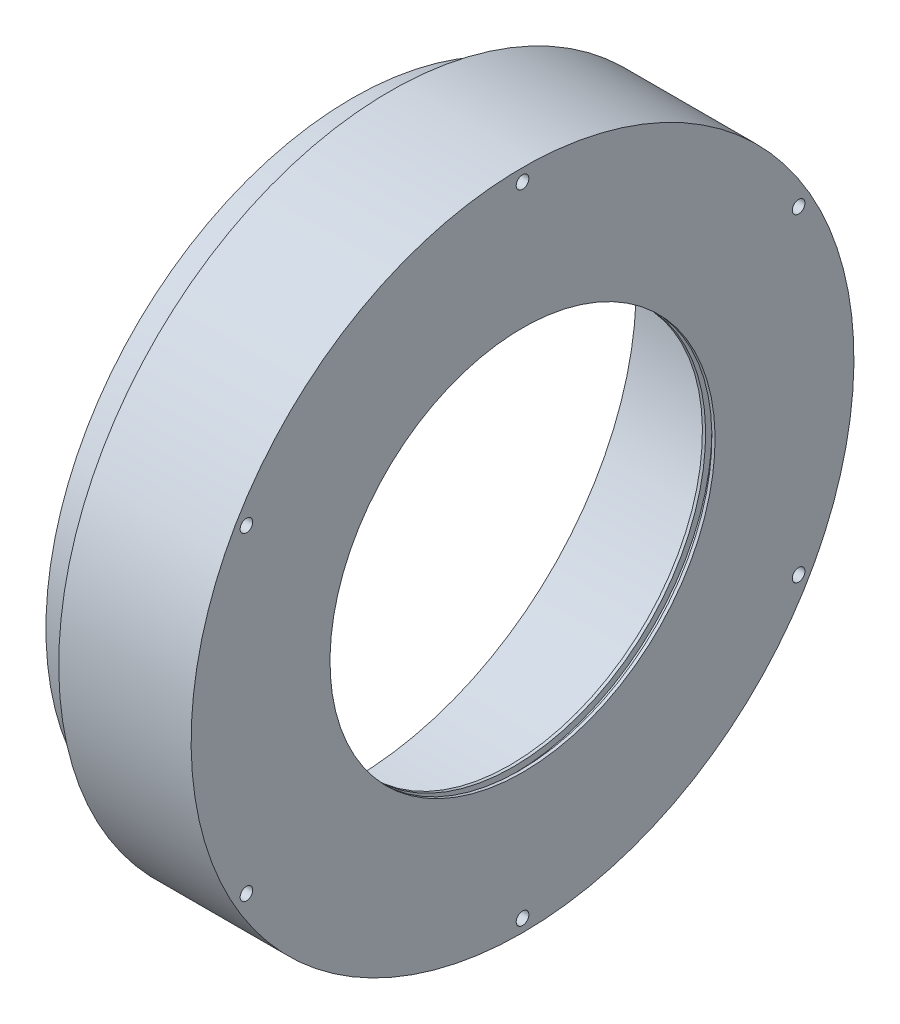
ISO-10303-21;
HEADER;
FILE_DESCRIPTION(('STEP AP214'),'2;1');
FILE_NAME('part.step','',(''),(''),'','','');
FILE_SCHEMA(('AUTOMOTIVE_DESIGN { 1 0 10303 214 1 1 1 1 }'));
ENDSEC;
DATA;
#1=APPLICATION_CONTEXT('core data for automotive mechanical design processes');
#2=APPLICATION_PROTOCOL_DEFINITION('international standard','automotive_design',2000,#1);
#3=PRODUCT_CONTEXT('',#1,'mechanical');
#4=PRODUCT('Part','Part','',(#3));
#5=PRODUCT_RELATED_PRODUCT_CATEGORY('part','',(#4));
#6=PRODUCT_DEFINITION_FORMATION('','',#4);
#7=PRODUCT_DEFINITION_CONTEXT('part definition',#1,'design');
#8=PRODUCT_DEFINITION('design','',#6,#7);
#9=PRODUCT_DEFINITION_SHAPE('','',#8);
#10=(LENGTH_UNIT() NAMED_UNIT(*) SI_UNIT(.MILLI.,.METRE.));
#11=(NAMED_UNIT(*) PLANE_ANGLE_UNIT() SI_UNIT($,.RADIAN.));
#12=(NAMED_UNIT(*) SI_UNIT($,.STERADIAN.) SOLID_ANGLE_UNIT());
#13=UNCERTAINTY_MEASURE_WITH_UNIT(LENGTH_MEASURE(1.E-05),#10,'distance_accuracy_value','');
#14=(GEOMETRIC_REPRESENTATION_CONTEXT(3) GLOBAL_UNCERTAINTY_ASSIGNED_CONTEXT((#13)) GLOBAL_UNIT_ASSIGNED_CONTEXT((#10,
#11,#12)) REPRESENTATION_CONTEXT('',''));
#15=CARTESIAN_POINT('',(0.,0.,0.));
#16=DIRECTION('',(0.,0.,1.));
#17=DIRECTION('',(1.,0.,0.));
#18=AXIS2_PLACEMENT_3D('',#15,#16,#17);
#19=CARTESIAN_POINT('',(6.02887681974582,0.,0.));
#20=DIRECTION('',(1.,0.,0.));
#21=DIRECTION('',(0.,1.,0.));
#22=AXIS2_PLACEMENT_3D('',#19,#20,#21);
#23=CYLINDRICAL_SURFACE('',#22,97.);
#24=CARTESIAN_POINT('',(12.0577536394916,0.,0.));
#25=DIRECTION('',(1.,0.,0.));
#26=DIRECTION('',(0.,0.,-1.));
#27=AXIS2_PLACEMENT_3D('',#24,#25,#26);
#28=CIRCLE('',#27,97.);
#29=CARTESIAN_POINT('',(12.0577536394916,-97.,0.));
#30=VERTEX_POINT('',#29);
#31=EDGE_CURVE('E177',#30,#30,#28,.T.);
#32=ORIENTED_EDGE('',*,*,#31,.F.);
#33=DIRECTION('',(-1.,0.,0.));
#34=VECTOR('',#33,1.);
#35=CARTESIAN_POINT('',(6.02887681974582,-97.,0.));
#36=LINE('',#35,#34);
#37=CARTESIAN_POINT('',(0.,-97.,0.));
#38=VERTEX_POINT('',#37);
#39=EDGE_CURVE('E11',#30,#38,#36,.T.);
#40=ORIENTED_EDGE('',*,*,#39,.T.);
#41=CARTESIAN_POINT('',(0.,0.,0.));
#42=DIRECTION('',(1.,0.,0.));
#43=DIRECTION('',(0.,0.,-1.));
#44=AXIS2_PLACEMENT_3D('',#41,#42,#43);
#45=CIRCLE('',#44,97.);
#46=EDGE_CURVE('E28',#38,#38,#45,.T.);
#47=ORIENTED_EDGE('',*,*,#46,.T.);
#48=ORIENTED_EDGE('',*,*,#39,.F.);
#49=EDGE_LOOP('',(#32,#40,#47,#48));
#50=FACE_BOUND('',#49,.T.);
#51=ADVANCED_FACE('F17',(#50),#23,.T.);
#52=CARTESIAN_POINT('',(0.,97.,0.));
#53=DIRECTION('',(-1.,0.,0.));
#54=DIRECTION('',(0.,0.,1.));
#55=AXIS2_PLACEMENT_3D('',#52,#53,#54);
#56=PLANE('',#55);
#57=CARTESIAN_POINT('',(0.,0.,0.));
#58=DIRECTION('',(1.,0.,0.));
#59=DIRECTION('',(0.,0.,-1.));
#60=AXIS2_PLACEMENT_3D('',#57,#58,#59);
#61=CIRCLE('',#60,90.);
#62=CARTESIAN_POINT('',(0.,-90.,0.));
#63=VERTEX_POINT('',#62);
#64=EDGE_CURVE('E21',#63,#63,#61,.T.);
#65=ORIENTED_EDGE('',*,*,#64,.T.);
#66=EDGE_LOOP('',(#65));
#67=FACE_BOUND('',#66,.T.);
#68=CARTESIAN_POINT('',(0.,0.,-93.));
#69=DIRECTION('',(1.,0.,0.));
#70=DIRECTION('',(0.,0.,1.));
#71=AXIS2_PLACEMENT_3D('',#68,#69,#70);
#72=CIRCLE('',#71,2.);
#73=CARTESIAN_POINT('',(0.,0.,-95.));
#74=VERTEX_POINT('',#73);
#75=EDGE_CURVE('E183',#74,#74,#72,.T.);
#76=ORIENTED_EDGE('',*,*,#75,.T.);
#77=EDGE_LOOP('',(#76));
#78=FACE_BOUND('',#77,.T.);
#79=CARTESIAN_POINT('',(0.,-93.,0.));
#80=DIRECTION('',(1.,0.,0.));
#81=DIRECTION('',(0.,0.,1.));
#82=AXIS2_PLACEMENT_3D('',#79,#80,#81);
#83=CIRCLE('',#82,2.);
#84=CARTESIAN_POINT('',(0.,-93.,-2.));
#85=VERTEX_POINT('',#84);
#86=EDGE_CURVE('E337',#85,#85,#83,.T.);
#87=ORIENTED_EDGE('',*,*,#86,.T.);
#88=EDGE_LOOP('',(#87));
#89=FACE_BOUND('',#88,.T.);
#90=CARTESIAN_POINT('',(0.,93.,0.));
#91=DIRECTION('',(1.,0.,0.));
#92=DIRECTION('',(0.,0.,1.));
#93=AXIS2_PLACEMENT_3D('',#90,#91,#92);
#94=CIRCLE('',#93,2.);
#95=CARTESIAN_POINT('',(0.,93.,-2.));
#96=VERTEX_POINT('',#95);
#97=EDGE_CURVE('E224',#96,#96,#94,.T.);
#98=ORIENTED_EDGE('',*,*,#97,.T.);
#99=EDGE_LOOP('',(#98));
#100=FACE_BOUND('',#99,.T.);
#101=CARTESIAN_POINT('',(0.,0.,93.));
#102=DIRECTION('',(1.,0.,0.));
#103=DIRECTION('',(0.,0.,1.));
#104=AXIS2_PLACEMENT_3D('',#101,#102,#103);
#105=CIRCLE('',#104,2.);
#106=CARTESIAN_POINT('',(0.,0.,91.));
#107=VERTEX_POINT('',#106);
#108=EDGE_CURVE('E160',#107,#107,#105,.T.);
#109=ORIENTED_EDGE('',*,*,#108,.T.);
#110=EDGE_LOOP('',(#109));
#111=FACE_BOUND('',#110,.T.);
#112=ORIENTED_EDGE('',*,*,#46,.F.);
#113=EDGE_LOOP('',(#112));
#114=FACE_BOUND('',#113,.T.);
#115=ADVANCED_FACE('F166',(#67,#78,#89,#100,#111,#114),#56,.T.);
#116=CARTESIAN_POINT('',(24.5,0.,0.));
#117=DIRECTION('',(1.,0.,0.));
#118=DIRECTION('',(0.,1.,0.));
#119=AXIS2_PLACEMENT_3D('',#116,#117,#118);
#120=CYLINDRICAL_SURFACE('',#119,90.);
#121=CARTESIAN_POINT('',(49.,0.,0.));
#122=DIRECTION('',(1.,0.,0.));
#123=DIRECTION('',(0.,0.,-1.));
#124=AXIS2_PLACEMENT_3D('',#121,#122,#123);
#125=CIRCLE('',#124,90.);
#126=CARTESIAN_POINT('',(49.,-90.,0.));
#127=VERTEX_POINT('',#126);
#128=EDGE_CURVE('E281',#127,#127,#125,.T.);
#129=ORIENTED_EDGE('',*,*,#128,.T.);
#130=DIRECTION('',(-1.,0.,0.));
#131=VECTOR('',#130,1.);
#132=CARTESIAN_POINT('',(24.5,-90.,0.));
#133=LINE('',#132,#131);
#134=EDGE_CURVE('E277',#127,#63,#133,.T.);
#135=ORIENTED_EDGE('',*,*,#134,.T.);
#136=ORIENTED_EDGE('',*,*,#64,.F.);
#137=ORIENTED_EDGE('',*,*,#134,.F.);
#138=EDGE_LOOP('',(#129,#135,#136,#137));
#139=FACE_BOUND('',#138,.T.);
#140=ADVANCED_FACE('F599',(#139),#120,.F.);
#141=CARTESIAN_POINT('',(49.,90.,0.));
#142=DIRECTION('',(-1.,0.,0.));
#143=DIRECTION('',(0.,0.,1.));
#144=AXIS2_PLACEMENT_3D('',#141,#142,#143);
#145=PLANE('',#144);
#146=CARTESIAN_POINT('',(49.,0.,0.));
#147=DIRECTION('',(1.,0.,0.));
#148=DIRECTION('',(0.,0.,-1.));
#149=AXIS2_PLACEMENT_3D('',#146,#147,#148);
#150=CIRCLE('',#149,86.);
#151=CARTESIAN_POINT('',(49.,-86.,0.));
#152=VERTEX_POINT('',#151);
#153=EDGE_CURVE('E233',#152,#152,#150,.T.);
#154=ORIENTED_EDGE('',*,*,#153,.T.);
#155=EDGE_LOOP('',(#154));
#156=FACE_BOUND('',#155,.T.);
#157=ORIENTED_EDGE('',*,*,#128,.F.);
#158=EDGE_LOOP('',(#157));
#159=FACE_BOUND('',#158,.T.);
#160=ADVANCED_FACE('F604',(#156,#159),#145,.T.);
#161=CARTESIAN_POINT('',(49.5,0.,0.));
#162=DIRECTION('',(1.,0.,0.));
#163=DIRECTION('',(0.,1.,0.));
#164=AXIS2_PLACEMENT_3D('',#161,#162,#163);
#165=CYLINDRICAL_SURFACE('',#164,86.);
#166=CARTESIAN_POINT('',(50.,0.,0.));
#167=DIRECTION('',(1.,0.,0.));
#168=DIRECTION('',(0.,0.,-1.));
#169=AXIS2_PLACEMENT_3D('',#166,#167,#168);
#170=CIRCLE('',#169,86.);
#171=CARTESIAN_POINT('',(50.,-86.,0.));
#172=VERTEX_POINT('',#171);
#173=EDGE_CURVE('E199',#172,#172,#170,.T.);
#174=ORIENTED_EDGE('',*,*,#173,.T.);
#175=DIRECTION('',(-1.,0.,0.));
#176=VECTOR('',#175,1.);
#177=CARTESIAN_POINT('',(49.5,-86.,0.));
#178=LINE('',#177,#176);
#179=EDGE_CURVE('E229',#172,#152,#178,.T.);
#180=ORIENTED_EDGE('',*,*,#179,.T.);
#181=ORIENTED_EDGE('',*,*,#153,.F.);
#182=ORIENTED_EDGE('',*,*,#179,.F.);
#183=EDGE_LOOP('',(#174,#180,#181,#182));
#184=FACE_BOUND('',#183,.T.);
#185=ADVANCED_FACE('F570',(#184),#165,.F.);
#186=CARTESIAN_POINT('',(50.,86.,0.));
#187=DIRECTION('',(-1.,0.,0.));
#188=DIRECTION('',(0.,0.,1.));
#189=AXIS2_PLACEMENT_3D('',#186,#187,#188);
#190=PLANE('',#189);
#191=CARTESIAN_POINT('',(50.,0.,0.));
#192=DIRECTION('',(1.,0.,0.));
#193=DIRECTION('',(0.,0.,-1.));
#194=AXIS2_PLACEMENT_3D('',#191,#192,#193);
#195=CIRCLE('',#194,61.);
#196=CARTESIAN_POINT('',(50.,-61.,0.));
#197=VERTEX_POINT('',#196);
#198=EDGE_CURVE('E195',#197,#197,#195,.T.);
#199=ORIENTED_EDGE('',*,*,#198,.T.);
#200=EDGE_LOOP('',(#199));
#201=FACE_BOUND('',#200,.T.);
#202=ORIENTED_EDGE('',*,*,#173,.F.);
#203=EDGE_LOOP('',(#202));
#204=FACE_BOUND('',#203,.T.);
#205=ADVANCED_FACE('F564',(#201,#204),#190,.T.);
#206=CARTESIAN_POINT('',(50.5,0.,0.));
#207=DIRECTION('',(1.,0.,0.));
#208=DIRECTION('',(0.,1.,0.));
#209=AXIS2_PLACEMENT_3D('',#206,#207,#208);
#210=CYLINDRICAL_SURFACE('',#209,61.);
#211=CARTESIAN_POINT('',(51.,0.,0.));
#212=DIRECTION('',(1.,0.,0.));
#213=DIRECTION('',(0.,0.,-1.));
#214=AXIS2_PLACEMENT_3D('',#211,#212,#213);
#215=CIRCLE('',#214,61.);
#216=CARTESIAN_POINT('',(51.,-61.,0.));
#217=VERTEX_POINT('',#216);
#218=EDGE_CURVE('E220',#217,#217,#215,.T.);
#219=ORIENTED_EDGE('',*,*,#218,.T.);
#220=DIRECTION('',(-1.,0.,0.));
#221=VECTOR('',#220,1.);
#222=CARTESIAN_POINT('',(50.5,-61.,0.));
#223=LINE('',#222,#221);
#224=EDGE_CURVE('E200',#217,#197,#223,.T.);
#225=ORIENTED_EDGE('',*,*,#224,.T.);
#226=ORIENTED_EDGE('',*,*,#198,.F.);
#227=ORIENTED_EDGE('',*,*,#224,.F.);
#228=EDGE_LOOP('',(#219,#225,#226,#227));
#229=FACE_BOUND('',#228,.T.);
#230=ADVANCED_FACE('F569',(#229),#210,.F.);
#231=CARTESIAN_POINT('',(51.,61.,0.));
#232=DIRECTION('',(1.,0.,0.));
#233=DIRECTION('',(0.,1.,0.));
#234=AXIS2_PLACEMENT_3D('',#231,#232,#233);
#235=PLANE('',#234);
#236=ORIENTED_EDGE('',*,*,#218,.F.);
#237=EDGE_LOOP('',(#236));
#238=FACE_BOUND('',#237,.T.);
#239=CARTESIAN_POINT('',(51.,0.,0.));
#240=DIRECTION('',(1.,0.,0.));
#241=DIRECTION('',(0.,0.,-1.));
#242=AXIS2_PLACEMENT_3D('',#239,#240,#241);
#243=CIRCLE('',#242,63.);
#244=CARTESIAN_POINT('',(51.,-63.,0.));
#245=VERTEX_POINT('',#244);
#246=EDGE_CURVE('E264',#245,#245,#243,.T.);
#247=ORIENTED_EDGE('',*,*,#246,.T.);
#248=EDGE_LOOP('',(#247));
#249=FACE_BOUND('',#248,.T.);
#250=ADVANCED_FACE('F583',(#238,#249),#235,.T.);
#251=CARTESIAN_POINT('',(52.,0.,0.));
#252=DIRECTION('',(1.,0.,0.));
#253=DIRECTION('',(0.,1.,0.));
#254=AXIS2_PLACEMENT_3D('',#251,#252,#253);
#255=CYLINDRICAL_SURFACE('',#254,63.);
#256=CARTESIAN_POINT('',(53.,0.,0.));
#257=DIRECTION('',(1.,0.,0.));
#258=DIRECTION('',(0.,0.,-1.));
#259=AXIS2_PLACEMENT_3D('',#256,#257,#258);
#260=CIRCLE('',#259,63.);
#261=CARTESIAN_POINT('',(53.,-63.,0.));
#262=VERTEX_POINT('',#261);
#263=EDGE_CURVE('E189',#262,#262,#260,.T.);
#264=ORIENTED_EDGE('',*,*,#263,.T.);
#265=DIRECTION('',(-1.,0.,0.));
#266=VECTOR('',#265,1.);
#267=CARTESIAN_POINT('',(52.,-63.,0.));
#268=LINE('',#267,#266);
#269=EDGE_CURVE('E193',#262,#245,#268,.T.);
#270=ORIENTED_EDGE('',*,*,#269,.T.);
#271=ORIENTED_EDGE('',*,*,#246,.F.);
#272=ORIENTED_EDGE('',*,*,#269,.F.);
#273=EDGE_LOOP('',(#264,#270,#271,#272));
#274=FACE_BOUND('',#273,.T.);
#275=ADVANCED_FACE('F577',(#274),#255,.F.);
#276=CARTESIAN_POINT('',(53.,63.,0.));
#277=DIRECTION('',(-1.,0.,0.));
#278=DIRECTION('',(0.,0.,1.));
#279=AXIS2_PLACEMENT_3D('',#276,#277,#278);
#280=PLANE('',#279);
#281=CARTESIAN_POINT('',(53.,0.,0.));
#282=DIRECTION('',(1.,0.,0.));
#283=DIRECTION('',(0.,0.,-1.));
#284=AXIS2_PLACEMENT_3D('',#281,#282,#283);
#285=CIRCLE('',#284,61.);
#286=CARTESIAN_POINT('',(53.,-61.,0.));
#287=VERTEX_POINT('',#286);
#288=EDGE_CURVE('E194',#287,#287,#285,.T.);
#289=ORIENTED_EDGE('',*,*,#288,.T.);
#290=EDGE_LOOP('',(#289));
#291=FACE_BOUND('',#290,.T.);
#292=ORIENTED_EDGE('',*,*,#263,.F.);
#293=EDGE_LOOP('',(#292));
#294=FACE_BOUND('',#293,.T.);
#295=ADVANCED_FACE('F582',(#291,#294),#280,.T.);
#296=CARTESIAN_POINT('',(53.5,0.,0.));
#297=DIRECTION('',(1.,0.,0.));
#298=DIRECTION('',(0.,1.,0.));
#299=AXIS2_PLACEMENT_3D('',#296,#297,#298);
#300=CYLINDRICAL_SURFACE('',#299,61.);
#301=CARTESIAN_POINT('',(54.,0.,0.));
#302=DIRECTION('',(1.,0.,0.));
#303=DIRECTION('',(0.,0.,-1.));
#304=AXIS2_PLACEMENT_3D('',#301,#302,#303);
#305=CIRCLE('',#304,61.);
#306=CARTESIAN_POINT('',(54.,-61.,0.));
#307=VERTEX_POINT('',#306);
#308=EDGE_CURVE('E207',#307,#307,#305,.T.);
#309=ORIENTED_EDGE('',*,*,#308,.T.);
#310=DIRECTION('',(-1.,0.,0.));
#311=VECTOR('',#310,1.);
#312=CARTESIAN_POINT('',(53.5,-61.,0.));
#313=LINE('',#312,#311);
#314=EDGE_CURVE('E211',#307,#287,#313,.T.);
#315=ORIENTED_EDGE('',*,*,#314,.T.);
#316=ORIENTED_EDGE('',*,*,#288,.F.);
#317=ORIENTED_EDGE('',*,*,#314,.F.);
#318=EDGE_LOOP('',(#309,#315,#316,#317));
#319=FACE_BOUND('',#318,.T.);
#320=ADVANCED_FACE('F590',(#319),#300,.F.);
#321=CARTESIAN_POINT('',(54.,61.,0.));
#322=DIRECTION('',(1.,0.,0.));
#323=DIRECTION('',(0.,1.,0.));
#324=AXIS2_PLACEMENT_3D('',#321,#322,#323);
#325=PLANE('',#324);
#326=ORIENTED_EDGE('',*,*,#308,.F.);
#327=EDGE_LOOP('',(#326));
#328=FACE_BOUND('',#327,.T.);
#329=CARTESIAN_POINT('',(54.,101.,0.));
#330=DIRECTION('',(-1.,0.,0.));
#331=DIRECTION('',(0.,0.,-1.));
#332=AXIS2_PLACEMENT_3D('',#329,#330,#331);
#333=CIRCLE('',#332,2.);
#334=CARTESIAN_POINT('',(54.,101.,2.));
#335=VERTEX_POINT('',#334);
#336=EDGE_CURVE('E175',#335,#335,#333,.T.);
#337=ORIENTED_EDGE('',*,*,#336,.T.);
#338=EDGE_LOOP('',(#337));
#339=FACE_BOUND('',#338,.T.);
#340=CARTESIAN_POINT('',(54.,-101.,0.));
#341=DIRECTION('',(-1.,0.,0.));
#342=DIRECTION('',(0.,0.,-1.));
#343=AXIS2_PLACEMENT_3D('',#340,#341,#342);
#344=CIRCLE('',#343,2.);
#345=CARTESIAN_POINT('',(54.,-101.,2.00000000000003));
#346=VERTEX_POINT('',#345);
#347=EDGE_CURVE('E201',#346,#346,#344,.T.);
#348=ORIENTED_EDGE('',*,*,#347,.T.);
#349=EDGE_LOOP('',(#348));
#350=FACE_BOUND('',#349,.T.);
#351=CARTESIAN_POINT('',(54.,-50.5,-87.4685657822283));
#352=DIRECTION('',(-1.,0.,0.));
#353=DIRECTION('',(0.,0.,-1.));
#354=AXIS2_PLACEMENT_3D('',#351,#352,#353);
#355=CIRCLE('',#354,2.);
#356=CARTESIAN_POINT('',(54.,-50.5,-85.4685657822283));
#357=VERTEX_POINT('',#356);
#358=EDGE_CURVE('E244',#357,#357,#355,.T.);
#359=ORIENTED_EDGE('',*,*,#358,.T.);
#360=EDGE_LOOP('',(#359));
#361=FACE_BOUND('',#360,.T.);
#362=CARTESIAN_POINT('',(54.,50.5,87.4685657822283));
#363=DIRECTION('',(-1.,0.,0.));
#364=DIRECTION('',(0.,0.,-1.));
#365=AXIS2_PLACEMENT_3D('',#362,#363,#364);
#366=CIRCLE('',#365,2.);
#367=CARTESIAN_POINT('',(54.,50.5,89.4685657822283));
#368=VERTEX_POINT('',#367);
#369=EDGE_CURVE('E256',#368,#368,#366,.T.);
#370=ORIENTED_EDGE('',*,*,#369,.T.);
#371=EDGE_LOOP('',(#370));
#372=FACE_BOUND('',#371,.T.);
#373=CARTESIAN_POINT('',(54.,-50.5,87.4685657822283));
#374=DIRECTION('',(-1.,0.,0.));
#375=DIRECTION('',(0.,0.,-1.));
#376=AXIS2_PLACEMENT_3D('',#373,#374,#375);
#377=CIRCLE('',#376,2.);
#378=CARTESIAN_POINT('',(54.,-50.5,89.4685657822283));
#379=VERTEX_POINT('',#378);
#380=EDGE_CURVE('E239',#379,#379,#377,.T.);
#381=ORIENTED_EDGE('',*,*,#380,.T.);
#382=EDGE_LOOP('',(#381));
#383=FACE_BOUND('',#382,.T.);
#384=CARTESIAN_POINT('',(54.,50.5,-87.4685657822283));
#385=DIRECTION('',(-1.,0.,0.));
#386=DIRECTION('',(0.,0.,-1.));
#387=AXIS2_PLACEMENT_3D('',#384,#385,#386);
#388=CIRCLE('',#387,2.);
#389=CARTESIAN_POINT('',(54.,50.5,-85.4685657822284));
#390=VERTEX_POINT('',#389);
#391=EDGE_CURVE('E216',#390,#390,#388,.T.);
#392=ORIENTED_EDGE('',*,*,#391,.T.);
#393=EDGE_LOOP('',(#392));
#394=FACE_BOUND('',#393,.T.);
#395=CARTESIAN_POINT('',(54.,0.,0.));
#396=DIRECTION('',(1.,0.,0.));
#397=DIRECTION('',(0.,0.,-1.));
#398=AXIS2_PLACEMENT_3D('',#395,#396,#397);
#399=CIRCLE('',#398,105.);
#400=CARTESIAN_POINT('',(54.,-105.,0.));
#401=VERTEX_POINT('',#400);
#402=EDGE_CURVE('E181',#401,#401,#399,.T.);
#403=ORIENTED_EDGE('',*,*,#402,.T.);
#404=EDGE_LOOP('',(#403));
#405=FACE_BOUND('',#404,.T.);
#406=ADVANCED_FACE('F543',(#328,#339,#350,#361,#372,#383,#394,#405),#325,.T.);
#407=CARTESIAN_POINT('',(33.0288768197458,0.,0.));
#408=DIRECTION('',(1.,0.,0.));
#409=DIRECTION('',(0.,1.,0.));
#410=AXIS2_PLACEMENT_3D('',#407,#408,#409);
#411=CYLINDRICAL_SURFACE('',#410,105.);
#412=ORIENTED_EDGE('',*,*,#402,.F.);
#413=DIRECTION('',(-1.,0.,0.));
#414=VECTOR('',#413,1.);
#415=CARTESIAN_POINT('',(33.0288768197458,-105.,0.));
#416=LINE('',#415,#414);
#417=CARTESIAN_POINT('',(12.0577536394916,-105.,0.));
#418=VERTEX_POINT('',#417);
#419=EDGE_CURVE('E212',#401,#418,#416,.T.);
#420=ORIENTED_EDGE('',*,*,#419,.T.);
#421=CARTESIAN_POINT('',(12.0577536394916,0.,0.));
#422=DIRECTION('',(1.,0.,0.));
#423=DIRECTION('',(0.,0.,-1.));
#424=AXIS2_PLACEMENT_3D('',#421,#422,#423);
#425=CIRCLE('',#424,105.);
#426=EDGE_CURVE('E182',#418,#418,#425,.T.);
#427=ORIENTED_EDGE('',*,*,#426,.T.);
#428=ORIENTED_EDGE('',*,*,#419,.F.);
#429=EDGE_LOOP('',(#412,#420,#427,#428));
#430=FACE_BOUND('',#429,.T.);
#431=ADVANCED_FACE('F538',(#430),#411,.T.);
#432=CARTESIAN_POINT('',(12.0577536394916,105.,0.));
#433=DIRECTION('',(-1.,0.,0.));
#434=DIRECTION('',(0.,0.,1.));
#435=AXIS2_PLACEMENT_3D('',#432,#433,#434);
#436=PLANE('',#435);
#437=ORIENTED_EDGE('',*,*,#31,.T.);
#438=EDGE_LOOP('',(#437));
#439=FACE_BOUND('',#438,.T.);
#440=CARTESIAN_POINT('',(12.0577536394916,101.,0.));
#441=DIRECTION('',(1.,0.,0.));
#442=DIRECTION('',(0.,0.,-1.));
#443=AXIS2_PLACEMENT_3D('',#440,#441,#442);
#444=CIRCLE('',#443,2.);
#445=CARTESIAN_POINT('',(12.0577536394916,101.,2.));
#446=VERTEX_POINT('',#445);
#447=EDGE_CURVE('E307',#446,#446,#444,.T.);
#448=ORIENTED_EDGE('',*,*,#447,.T.);
#449=EDGE_LOOP('',(#448));
#450=FACE_BOUND('',#449,.T.);
#451=CARTESIAN_POINT('',(12.0577536394916,-101.,0.));
#452=DIRECTION('',(1.,0.,0.));
#453=DIRECTION('',(0.,0.,-1.));
#454=AXIS2_PLACEMENT_3D('',#451,#452,#453);
#455=CIRCLE('',#454,2.);
#456=CARTESIAN_POINT('',(12.0577536394916,-101.,2.00000000000003));
#457=VERTEX_POINT('',#456);
#458=EDGE_CURVE('E274',#457,#457,#455,.T.);
#459=ORIENTED_EDGE('',*,*,#458,.T.);
#460=EDGE_LOOP('',(#459));
#461=FACE_BOUND('',#460,.T.);
#462=CARTESIAN_POINT('',(12.0577536394916,-50.5,-87.4685657822283));
#463=DIRECTION('',(1.,0.,0.));
#464=DIRECTION('',(0.,0.,-1.));
#465=AXIS2_PLACEMENT_3D('',#462,#463,#464);
#466=CIRCLE('',#465,2.);
#467=CARTESIAN_POINT('',(12.0577536394916,-50.5,-85.4685657822283));
#468=VERTEX_POINT('',#467);
#469=EDGE_CURVE('E206',#468,#468,#466,.T.);
#470=ORIENTED_EDGE('',*,*,#469,.T.);
#471=EDGE_LOOP('',(#470));
#472=FACE_BOUND('',#471,.T.);
#473=CARTESIAN_POINT('',(12.0577536394916,50.5,87.4685657822283));
#474=DIRECTION('',(1.,0.,0.));
#475=DIRECTION('',(0.,0.,-1.));
#476=AXIS2_PLACEMENT_3D('',#473,#474,#475);
#477=CIRCLE('',#476,2.);
#478=CARTESIAN_POINT('',(12.0577536394916,50.5,89.4685657822283));
#479=VERTEX_POINT('',#478);
#480=EDGE_CURVE('E240',#479,#479,#477,.T.);
#481=ORIENTED_EDGE('',*,*,#480,.T.);
#482=EDGE_LOOP('',(#481));
#483=FACE_BOUND('',#482,.T.);
#484=CARTESIAN_POINT('',(12.0577536394916,-50.5,87.4685657822283));
#485=DIRECTION('',(1.,0.,0.));
#486=DIRECTION('',(0.,0.,-1.));
#487=AXIS2_PLACEMENT_3D('',#484,#485,#486);
#488=CIRCLE('',#487,2.);
#489=CARTESIAN_POINT('',(12.0577536394916,-50.5,89.4685657822283));
#490=VERTEX_POINT('',#489);
#491=EDGE_CURVE('E238',#490,#490,#488,.T.);
#492=ORIENTED_EDGE('',*,*,#491,.T.);
#493=EDGE_LOOP('',(#492));
#494=FACE_BOUND('',#493,.T.);
#495=CARTESIAN_POINT('',(12.0577536394916,50.5,-87.4685657822283));
#496=DIRECTION('',(1.,0.,0.));
#497=DIRECTION('',(0.,0.,-1.));
#498=AXIS2_PLACEMENT_3D('',#495,#496,#497);
#499=CIRCLE('',#498,2.);
#500=CARTESIAN_POINT('',(12.0577536394916,50.5,-85.4685657822284));
#501=VERTEX_POINT('',#500);
#502=EDGE_CURVE('E269',#501,#501,#499,.T.);
#503=ORIENTED_EDGE('',*,*,#502,.T.);
#504=EDGE_LOOP('',(#503));
#505=FACE_BOUND('',#504,.T.);
#506=ORIENTED_EDGE('',*,*,#426,.F.);
#507=EDGE_LOOP('',(#506));
#508=FACE_BOUND('',#507,.T.);
#509=ADVANCED_FACE('F19',(#439,#450,#461,#472,#483,#494,#505,#508),#436,.T.);
#510=CARTESIAN_POINT('',(54.,101.,0.));
#511=DIRECTION('',(-1.,0.,0.));
#512=DIRECTION('',(0.,0.,-1.));
#513=AXIS2_PLACEMENT_3D('',#510,#511,#512);
#514=CYLINDRICAL_SURFACE('',#513,2.);
#515=ORIENTED_EDGE('',*,*,#336,.F.);
#516=DIRECTION('',(-1.,0.,0.));
#517=VECTOR('',#516,1.);
#518=CARTESIAN_POINT('',(54.,101.,2.));
#519=LINE('',#518,#517);
#520=EDGE_CURVE('E303',#335,#446,#519,.T.);
#521=ORIENTED_EDGE('',*,*,#520,.T.);
#522=ORIENTED_EDGE('',*,*,#447,.F.);
#523=ORIENTED_EDGE('',*,*,#520,.F.);
#524=EDGE_LOOP('',(#515,#521,#522,#523));
#525=FACE_BOUND('',#524,.T.);
#526=ADVANCED_FACE('F347',(#525),#514,.F.);
#527=CARTESIAN_POINT('',(54.,-101.,0.));
#528=DIRECTION('',(-1.,0.,0.));
#529=DIRECTION('',(0.,0.,-1.));
#530=AXIS2_PLACEMENT_3D('',#527,#528,#529);
#531=CYLINDRICAL_SURFACE('',#530,2.);
#532=ORIENTED_EDGE('',*,*,#347,.F.);
#533=DIRECTION('',(-1.,0.,0.));
#534=VECTOR('',#533,1.);
#535=CARTESIAN_POINT('',(54.,-101.,2.00000000000003));
#536=LINE('',#535,#534);
#537=EDGE_CURVE('E205',#346,#457,#536,.T.);
#538=ORIENTED_EDGE('',*,*,#537,.T.);
#539=ORIENTED_EDGE('',*,*,#458,.F.);
#540=ORIENTED_EDGE('',*,*,#537,.F.);
#541=EDGE_LOOP('',(#532,#538,#539,#540));
#542=FACE_BOUND('',#541,.T.);
#543=ADVANCED_FACE('F532',(#542),#531,.F.);
#544=CARTESIAN_POINT('',(54.,-50.5,-87.4685657822283));
#545=DIRECTION('',(-1.,0.,0.));
#546=DIRECTION('',(0.,0.,-1.));
#547=AXIS2_PLACEMENT_3D('',#544,#545,#546);
#548=CYLINDRICAL_SURFACE('',#547,2.);
#549=ORIENTED_EDGE('',*,*,#358,.F.);
#550=DIRECTION('',(-1.,0.,0.));
#551=VECTOR('',#550,1.);
#552=CARTESIAN_POINT('',(54.,-50.5,-85.4685657822283));
#553=LINE('',#552,#551);
#554=EDGE_CURVE('E260',#357,#468,#553,.T.);
#555=ORIENTED_EDGE('',*,*,#554,.T.);
#556=ORIENTED_EDGE('',*,*,#469,.F.);
#557=ORIENTED_EDGE('',*,*,#554,.F.);
#558=EDGE_LOOP('',(#549,#555,#556,#557));
#559=FACE_BOUND('',#558,.T.);
#560=ADVANCED_FACE('F694',(#559),#548,.F.);
#561=CARTESIAN_POINT('',(54.,50.5,87.4685657822283));
#562=DIRECTION('',(-1.,0.,0.));
#563=DIRECTION('',(0.,0.,-1.));
#564=AXIS2_PLACEMENT_3D('',#561,#562,#563);
#565=CYLINDRICAL_SURFACE('',#564,2.);
#566=ORIENTED_EDGE('',*,*,#369,.F.);
#567=DIRECTION('',(-1.,0.,0.));
#568=VECTOR('',#567,1.);
#569=CARTESIAN_POINT('',(54.,50.5,89.4685657822283));
#570=LINE('',#569,#568);
#571=EDGE_CURVE('E245',#368,#479,#570,.T.);
#572=ORIENTED_EDGE('',*,*,#571,.T.);
#573=ORIENTED_EDGE('',*,*,#480,.F.);
#574=ORIENTED_EDGE('',*,*,#571,.F.);
#575=EDGE_LOOP('',(#566,#572,#573,#574));
#576=FACE_BOUND('',#575,.T.);
#577=ADVANCED_FACE('F669',(#576),#565,.F.);
#578=CARTESIAN_POINT('',(54.,-50.5,87.4685657822283));
#579=DIRECTION('',(-1.,0.,0.));
#580=DIRECTION('',(0.,0.,-1.));
#581=AXIS2_PLACEMENT_3D('',#578,#579,#580);
#582=CYLINDRICAL_SURFACE('',#581,2.);
#583=ORIENTED_EDGE('',*,*,#380,.F.);
#584=DIRECTION('',(-1.,0.,0.));
#585=VECTOR('',#584,1.);
#586=CARTESIAN_POINT('',(54.,-50.5,89.4685657822283));
#587=LINE('',#586,#585);
#588=EDGE_CURVE('E234',#379,#490,#587,.T.);
#589=ORIENTED_EDGE('',*,*,#588,.T.);
#590=ORIENTED_EDGE('',*,*,#491,.F.);
#591=ORIENTED_EDGE('',*,*,#588,.F.);
#592=EDGE_LOOP('',(#583,#589,#590,#591));
#593=FACE_BOUND('',#592,.T.);
#594=ADVANCED_FACE('F521',(#593),#582,.F.);
#595=CARTESIAN_POINT('',(54.,50.5,-87.4685657822283));
#596=DIRECTION('',(-1.,0.,0.));
#597=DIRECTION('',(0.,0.,-1.));
#598=AXIS2_PLACEMENT_3D('',#595,#596,#597);
#599=CYLINDRICAL_SURFACE('',#598,2.);
#600=ORIENTED_EDGE('',*,*,#391,.F.);
#601=DIRECTION('',(-1.,0.,0.));
#602=VECTOR('',#601,1.);
#603=CARTESIAN_POINT('',(54.,50.5,-85.4685657822284));
#604=LINE('',#603,#602);
#605=EDGE_CURVE('E268',#390,#501,#604,.T.);
#606=ORIENTED_EDGE('',*,*,#605,.T.);
#607=ORIENTED_EDGE('',*,*,#502,.F.);
#608=ORIENTED_EDGE('',*,*,#605,.F.);
#609=EDGE_LOOP('',(#600,#606,#607,#608));
#610=FACE_BOUND('',#609,.T.);
#611=ADVANCED_FACE('F515',(#610),#599,.F.);
#612=CARTESIAN_POINT('',(10.,0.,-93.));
#613=DIRECTION('',(-1.,0.,0.));
#614=DIRECTION('',(0.,0.,1.));
#615=AXIS2_PLACEMENT_3D('',#612,#613,#614);
#616=PLANE('',#615);
#617=CARTESIAN_POINT('',(10.,0.,-93.));
#618=DIRECTION('',(1.,0.,0.));
#619=DIRECTION('',(0.,0.,1.));
#620=AXIS2_PLACEMENT_3D('',#617,#618,#619);
#621=CIRCLE('',#620,2.);
#622=CARTESIAN_POINT('',(10.,0.,-95.));
#623=VERTEX_POINT('',#622);
#624=EDGE_CURVE('E213',#623,#623,#621,.T.);
#625=ORIENTED_EDGE('',*,*,#624,.F.);
#626=EDGE_LOOP('',(#625));
#627=FACE_BOUND('',#626,.T.);
#628=ADVANCED_FACE('F520',(#627),#616,.T.);
#629=CARTESIAN_POINT('',(0.,0.,-93.));
#630=DIRECTION('',(1.,0.,0.));
#631=DIRECTION('',(0.,0.,1.));
#632=AXIS2_PLACEMENT_3D('',#629,#630,#631);
#633=CYLINDRICAL_SURFACE('',#632,2.);
#634=ORIENTED_EDGE('',*,*,#75,.F.);
#635=DIRECTION('',(1.,0.,0.));
#636=VECTOR('',#635,1.);
#637=CARTESIAN_POINT('',(0.,0.,-95.));
#638=LINE('',#637,#636);
#639=EDGE_CURVE('E187',#74,#623,#638,.T.);
#640=ORIENTED_EDGE('',*,*,#639,.T.);
#641=ORIENTED_EDGE('',*,*,#624,.T.);
#642=ORIENTED_EDGE('',*,*,#639,.F.);
#643=EDGE_LOOP('',(#634,#640,#641,#642));
#644=FACE_BOUND('',#643,.T.);
#645=ADVANCED_FACE('F675',(#644),#633,.F.);
#646=CARTESIAN_POINT('',(10.,-93.,0.));
#647=DIRECTION('',(-1.,0.,0.));
#648=DIRECTION('',(0.,0.,1.));
#649=AXIS2_PLACEMENT_3D('',#646,#647,#648);
#650=PLANE('',#649);
#651=CARTESIAN_POINT('',(10.,-93.,0.));
#652=DIRECTION('',(1.,0.,0.));
#653=DIRECTION('',(0.,0.,1.));
#654=AXIS2_PLACEMENT_3D('',#651,#652,#653);
#655=CIRCLE('',#654,2.);
#656=CARTESIAN_POINT('',(10.,-93.,-2.));
#657=VERTEX_POINT('',#656);
#658=EDGE_CURVE('E188',#657,#657,#655,.T.);
#659=ORIENTED_EDGE('',*,*,#658,.F.);
#660=EDGE_LOOP('',(#659));
#661=FACE_BOUND('',#660,.T.);
#662=ADVANCED_FACE('F505',(#661),#650,.T.);
#663=CARTESIAN_POINT('',(0.,-93.,0.));
#664=DIRECTION('',(1.,0.,0.));
#665=DIRECTION('',(0.,0.,1.));
#666=AXIS2_PLACEMENT_3D('',#663,#664,#665);
#667=CYLINDRICAL_SURFACE('',#666,2.);
#668=ORIENTED_EDGE('',*,*,#86,.F.);
#669=DIRECTION('',(1.,0.,0.));
#670=VECTOR('',#669,1.);
#671=CARTESIAN_POINT('',(0.,-93.,-2.));
#672=LINE('',#671,#670);
#673=EDGE_CURVE('E316',#85,#657,#672,.T.);
#674=ORIENTED_EDGE('',*,*,#673,.T.);
#675=ORIENTED_EDGE('',*,*,#658,.T.);
#676=ORIENTED_EDGE('',*,*,#673,.F.);
#677=EDGE_LOOP('',(#668,#674,#675,#676));
#678=FACE_BOUND('',#677,.T.);
#679=ADVANCED_FACE('F501',(#678),#667,.F.);
#680=CARTESIAN_POINT('',(10.,93.,0.));
#681=DIRECTION('',(-1.,0.,0.));
#682=DIRECTION('',(0.,0.,1.));
#683=AXIS2_PLACEMENT_3D('',#680,#681,#682);
#684=PLANE('',#683);
#685=CARTESIAN_POINT('',(10.,93.,0.));
#686=DIRECTION('',(1.,0.,0.));
#687=DIRECTION('',(0.,0.,1.));
#688=AXIS2_PLACEMENT_3D('',#685,#686,#687);
#689=CIRCLE('',#688,2.);
#690=CARTESIAN_POINT('',(10.,93.,-2.));
#691=VERTEX_POINT('',#690);
#692=EDGE_CURVE('E249',#691,#691,#689,.T.);
#693=ORIENTED_EDGE('',*,*,#692,.F.);
#694=EDGE_LOOP('',(#693));
#695=FACE_BOUND('',#694,.T.);
#696=ADVANCED_FACE('F495',(#695),#684,.T.);
#697=CARTESIAN_POINT('',(0.,93.,0.));
#698=DIRECTION('',(1.,0.,0.));
#699=DIRECTION('',(0.,0.,1.));
#700=AXIS2_PLACEMENT_3D('',#697,#698,#699);
#701=CYLINDRICAL_SURFACE('',#700,2.);
#702=ORIENTED_EDGE('',*,*,#97,.F.);
#703=DIRECTION('',(1.,0.,0.));
#704=VECTOR('',#703,1.);
#705=CARTESIAN_POINT('',(0.,93.,-2.));
#706=LINE('',#705,#704);
#707=EDGE_CURVE('E228',#96,#691,#706,.T.);
#708=ORIENTED_EDGE('',*,*,#707,.T.);
#709=ORIENTED_EDGE('',*,*,#692,.T.);
#710=ORIENTED_EDGE('',*,*,#707,.F.);
#711=EDGE_LOOP('',(#702,#708,#709,#710));
#712=FACE_BOUND('',#711,.T.);
#713=ADVANCED_FACE('F489',(#712),#701,.F.);
#714=CARTESIAN_POINT('',(10.,0.,93.));
#715=DIRECTION('',(-1.,0.,0.));
#716=DIRECTION('',(0.,0.,1.));
#717=AXIS2_PLACEMENT_3D('',#714,#715,#716);
#718=PLANE('',#717);
#719=CARTESIAN_POINT('',(10.,0.,93.));
#720=DIRECTION('',(1.,0.,0.));
#721=DIRECTION('',(0.,0.,1.));
#722=AXIS2_PLACEMENT_3D('',#719,#720,#721);
#723=CIRCLE('',#722,2.);
#724=CARTESIAN_POINT('',(10.,0.,91.));
#725=VERTEX_POINT('',#724);
#726=EDGE_CURVE('E162',#725,#725,#723,.T.);
#727=ORIENTED_EDGE('',*,*,#726,.F.);
#728=EDGE_LOOP('',(#727));
#729=FACE_BOUND('',#728,.T.);
#730=ADVANCED_FACE('F494',(#729),#718,.T.);
#731=CARTESIAN_POINT('',(0.,0.,93.));
#732=DIRECTION('',(1.,0.,0.));
#733=DIRECTION('',(0.,0.,1.));
#734=AXIS2_PLACEMENT_3D('',#731,#732,#733);
#735=CYLINDRICAL_SURFACE('',#734,2.);
#736=ORIENTED_EDGE('',*,*,#108,.F.);
#737=DIRECTION('',(1.,0.,0.));
#738=VECTOR('',#737,1.);
#739=CARTESIAN_POINT('',(0.,0.,91.));
#740=LINE('',#739,#738);
#741=EDGE_CURVE('E157',#107,#725,#740,.T.);
#742=ORIENTED_EDGE('',*,*,#741,.T.);
#743=ORIENTED_EDGE('',*,*,#726,.T.);
#744=ORIENTED_EDGE('',*,*,#741,.F.);
#745=EDGE_LOOP('',(#736,#742,#743,#744));
#746=FACE_BOUND('',#745,.T.);
#747=ADVANCED_FACE('F159',(#746),#735,.F.);
#748=CLOSED_SHELL('',(#51,#115,#140,#160,#185,#205,#230,#250,#275,#295,#320,#406,#431,#509,#526,
#543,#560,#577,#594,#611,#628,#645,#662,#679,#696,#713,#730,#747));
#749=MANIFOLD_SOLID_BREP('B1',#748);
#750=ADVANCED_BREP_SHAPE_REPRESENTATION('',(#18,#749),#14);
#751=SHAPE_DEFINITION_REPRESENTATION(#9,#750);
ENDSEC;
END-ISO-10303-21;
